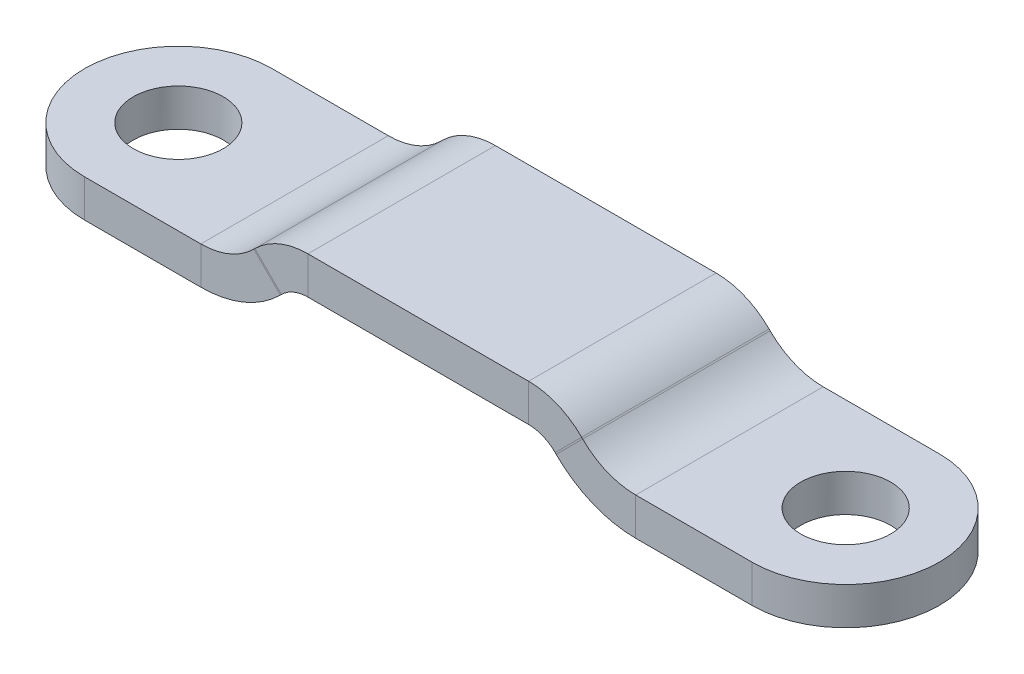
ISO-10303-21;
HEADER;
FILE_DESCRIPTION(('STEP AP214'),'2;1');
FILE_NAME('part.step','',(''),(''),'','','');
FILE_SCHEMA(('AUTOMOTIVE_DESIGN { 1 0 10303 214 1 1 1 1 }'));
ENDSEC;
DATA;
#1=APPLICATION_CONTEXT('core data for automotive mechanical design processes');
#2=APPLICATION_PROTOCOL_DEFINITION('international standard','automotive_design',2000,#1);
#3=PRODUCT_CONTEXT('',#1,'mechanical');
#4=PRODUCT('Part','Part','',(#3));
#5=PRODUCT_RELATED_PRODUCT_CATEGORY('part','',(#4));
#6=PRODUCT_DEFINITION_FORMATION('','',#4);
#7=PRODUCT_DEFINITION_CONTEXT('part definition',#1,'design');
#8=PRODUCT_DEFINITION('design','',#6,#7);
#9=PRODUCT_DEFINITION_SHAPE('','',#8);
#10=(LENGTH_UNIT() NAMED_UNIT(*) SI_UNIT(.MILLI.,.METRE.));
#11=(NAMED_UNIT(*) PLANE_ANGLE_UNIT() SI_UNIT($,.RADIAN.));
#12=(NAMED_UNIT(*) SI_UNIT($,.STERADIAN.) SOLID_ANGLE_UNIT());
#13=UNCERTAINTY_MEASURE_WITH_UNIT(LENGTH_MEASURE(1.E-05),#10,'distance_accuracy_value','');
#14=(GEOMETRIC_REPRESENTATION_CONTEXT(3) GLOBAL_UNCERTAINTY_ASSIGNED_CONTEXT((#13)) GLOBAL_UNIT_ASSIGNED_CONTEXT((#10,
#11,#12)) REPRESENTATION_CONTEXT('',''));
#15=CARTESIAN_POINT('',(0.,0.,0.));
#16=DIRECTION('',(0.,0.,1.));
#17=DIRECTION('',(1.,0.,0.));
#18=AXIS2_PLACEMENT_3D('',#15,#16,#17);
#19=CARTESIAN_POINT('',(-57.,0.,25.));
#20=DIRECTION('',(0.,-1.,0.));
#21=DIRECTION('',(0.,0.,-1.));
#22=AXIS2_PLACEMENT_3D('',#19,#20,#21);
#23=PLANE('',#22);
#24=CARTESIAN_POINT('',(-44.5,0.,12.5));
#25=DIRECTION('',(0.,1.,0.));
#26=DIRECTION('',(0.,0.,1.));
#27=AXIS2_PLACEMENT_3D('',#24,#25,#26);
#28=CIRCLE('',#27,6.);
#29=CARTESIAN_POINT('',(-44.5,0.,18.5));
#30=VERTEX_POINT('',#29);
#31=EDGE_CURVE('E954',#30,#30,#28,.T.);
#32=ORIENTED_EDGE('',*,*,#31,.F.);
#33=EDGE_LOOP('',(#32));
#34=FACE_BOUND('',#33,.T.);
#35=DIRECTION('',(-1.,0.,0.));
#36=VECTOR('',#35,1.);
#37=CARTESIAN_POINT('',(-57.,0.,0.));
#38=LINE('',#37,#36);
#39=CARTESIAN_POINT('',(-29.,0.,0.));
#40=VERTEX_POINT('',#39);
#41=CARTESIAN_POINT('',(-44.5,0.,0.));
#42=VERTEX_POINT('',#41);
#43=EDGE_CURVE('E271',#40,#42,#38,.T.);
#44=ORIENTED_EDGE('',*,*,#43,.T.);
#45=CARTESIAN_POINT('',(-44.5,0.,12.5));
#46=DIRECTION('',(0.,1.,0.));
#47=DIRECTION('',(0.,0.,1.));
#48=AXIS2_PLACEMENT_3D('',#45,#46,#47);
#49=CIRCLE('',#48,12.5);
#50=CARTESIAN_POINT('',(-44.5,0.,25.));
#51=VERTEX_POINT('',#50);
#52=EDGE_CURVE('E441',#42,#51,#49,.T.);
#53=ORIENTED_EDGE('',*,*,#52,.T.);
#54=DIRECTION('',(-1.,0.,0.));
#55=VECTOR('',#54,1.);
#56=CARTESIAN_POINT('',(-57.,0.,25.));
#57=LINE('',#56,#55);
#58=CARTESIAN_POINT('',(-29.,0.,25.));
#59=VERTEX_POINT('',#58);
#60=EDGE_CURVE('E319',#59,#51,#57,.T.);
#61=ORIENTED_EDGE('',*,*,#60,.F.);
#62=DIRECTION('',(0.,0.,-1.));
#63=VECTOR('',#62,1.);
#64=CARTESIAN_POINT('',(-29.,0.,25.));
#65=LINE('',#64,#63);
#66=EDGE_CURVE('E267',#59,#40,#65,.T.);
#67=ORIENTED_EDGE('',*,*,#66,.T.);
#68=EDGE_LOOP('',(#44,#53,#61,#67));
#69=FACE_BOUND('',#68,.T.);
#70=ADVANCED_FACE('F95',(#34,#69),#23,.F.);
#71=CARTESIAN_POINT('',(-57.,-5.,25.));
#72=DIRECTION('',(0.,-1.,0.));
#73=DIRECTION('',(0.,0.,-1.));
#74=AXIS2_PLACEMENT_3D('',#71,#72,#73);
#75=PLANE('',#74);
#76=CARTESIAN_POINT('',(-44.5,-5.,12.5));
#77=DIRECTION('',(0.,-1.,0.));
#78=DIRECTION('',(0.,0.,-1.));
#79=AXIS2_PLACEMENT_3D('',#76,#77,#78);
#80=CIRCLE('',#79,6.);
#81=CARTESIAN_POINT('',(-44.5,-5.,6.5));
#82=VERTEX_POINT('',#81);
#83=EDGE_CURVE('E99',#82,#82,#80,.T.);
#84=ORIENTED_EDGE('',*,*,#83,.F.);
#85=EDGE_LOOP('',(#84));
#86=FACE_BOUND('',#85,.T.);
#87=CARTESIAN_POINT('',(-44.5,-5.,12.5));
#88=DIRECTION('',(0.,-1.,0.));
#89=DIRECTION('',(0.,0.,-1.));
#90=AXIS2_PLACEMENT_3D('',#87,#88,#89);
#91=CIRCLE('',#90,12.5);
#92=CARTESIAN_POINT('',(-44.5,-5.,25.));
#93=VERTEX_POINT('',#92);
#94=CARTESIAN_POINT('',(-44.5,-5.,0.));
#95=VERTEX_POINT('',#94);
#96=EDGE_CURVE('E111',#93,#95,#91,.T.);
#97=ORIENTED_EDGE('',*,*,#96,.T.);
#98=DIRECTION('',(1.,0.,0.));
#99=VECTOR('',#98,1.);
#100=CARTESIAN_POINT('',(-57.,-5.,0.));
#101=LINE('',#100,#99);
#102=CARTESIAN_POINT('',(-29.,-5.,0.));
#103=VERTEX_POINT('',#102);
#104=EDGE_CURVE('E274',#103,#95,#101,.F.);
#105=ORIENTED_EDGE('',*,*,#104,.F.);
#106=DIRECTION('',(0.,0.,-1.));
#107=VECTOR('',#106,1.);
#108=CARTESIAN_POINT('',(-29.,-5.,25.));
#109=LINE('',#108,#107);
#110=CARTESIAN_POINT('',(-29.,-5.,25.));
#111=VERTEX_POINT('',#110);
#112=EDGE_CURVE('E357',#111,#103,#109,.T.);
#113=ORIENTED_EDGE('',*,*,#112,.F.);
#114=DIRECTION('',(1.,0.,0.));
#115=VECTOR('',#114,1.);
#116=CARTESIAN_POINT('',(-57.,-5.,25.));
#117=LINE('',#116,#115);
#118=EDGE_CURVE('E451',#111,#93,#117,.F.);
#119=ORIENTED_EDGE('',*,*,#118,.T.);
#120=EDGE_LOOP('',(#97,#105,#113,#119));
#121=FACE_BOUND('',#120,.T.);
#122=ADVANCED_FACE('F516',(#86,#121),#75,.T.);
#123=CARTESIAN_POINT('',(-18.3933982822018,-0.606601717798196,0.));
#124=DIRECTION('',(0.,0.,-1.));
#125=DIRECTION('',(-1.,0.,0.));
#126=AXIS2_PLACEMENT_3D('',#123,#124,#125);
#127=PLANE('',#126);
#128=ORIENTED_EDGE('',*,*,#104,.T.);
#129=DIRECTION('',(0.,1.,0.));
#130=VECTOR('',#129,1.);
#131=CARTESIAN_POINT('',(-44.5,-10.,0.));
#132=LINE('',#131,#130);
#133=EDGE_CURVE('E12',#95,#42,#132,.T.);
#134=ORIENTED_EDGE('',*,*,#133,.T.);
#135=ORIENTED_EDGE('',*,*,#43,.F.);
#136=DIRECTION('',(0.,-1.,0.));
#137=VECTOR('',#136,1.);
#138=CARTESIAN_POINT('',(-29.,0.,0.));
#139=LINE('',#138,#137);
#140=EDGE_CURVE('E178',#40,#103,#139,.T.);
#141=ORIENTED_EDGE('',*,*,#140,.T.);
#142=EDGE_LOOP('',(#128,#134,#135,#141));
#143=FACE_BOUND('',#142,.T.);
#144=ADVANCED_FACE('F523',(#143),#127,.T.);
#145=CARTESIAN_POINT('',(57.,-5.,25.));
#146=DIRECTION('',(0.,-1.,0.));
#147=DIRECTION('',(0.,0.,-1.));
#148=AXIS2_PLACEMENT_3D('',#145,#146,#147);
#149=PLANE('',#148);
#150=DIRECTION('',(1.,0.,0.));
#151=VECTOR('',#150,1.);
#152=CARTESIAN_POINT('',(57.,-5.,0.));
#153=LINE('',#152,#151);
#154=CARTESIAN_POINT('',(44.5,-5.,0.));
#155=VERTEX_POINT('',#154);
#156=CARTESIAN_POINT('',(29.,-5.,0.));
#157=VERTEX_POINT('',#156);
#158=EDGE_CURVE('E298',#155,#157,#153,.F.);
#159=ORIENTED_EDGE('',*,*,#158,.F.);
#160=CARTESIAN_POINT('',(44.5,-5.,12.5));
#161=DIRECTION('',(0.,-1.,0.));
#162=DIRECTION('',(0.,0.,-1.));
#163=AXIS2_PLACEMENT_3D('',#160,#161,#162);
#164=CIRCLE('',#163,12.5);
#165=CARTESIAN_POINT('',(44.5,-5.,25.));
#166=VERTEX_POINT('',#165);
#167=EDGE_CURVE('E275',#166,#155,#164,.F.);
#168=ORIENTED_EDGE('',*,*,#167,.F.);
#169=DIRECTION('',(1.,0.,0.));
#170=VECTOR('',#169,1.);
#171=CARTESIAN_POINT('',(57.,-5.,25.));
#172=LINE('',#171,#170);
#173=CARTESIAN_POINT('',(29.,-5.,25.));
#174=VERTEX_POINT('',#173);
#175=EDGE_CURVE('E412',#166,#174,#172,.F.);
#176=ORIENTED_EDGE('',*,*,#175,.T.);
#177=DIRECTION('',(0.,0.,-1.));
#178=VECTOR('',#177,1.);
#179=CARTESIAN_POINT('',(29.,-5.,25.));
#180=LINE('',#179,#178);
#181=EDGE_CURVE('E336',#174,#157,#180,.T.);
#182=ORIENTED_EDGE('',*,*,#181,.T.);
#183=EDGE_LOOP('',(#159,#168,#176,#182));
#184=FACE_BOUND('',#183,.T.);
#185=CARTESIAN_POINT('',(44.5,-5.,12.5));
#186=DIRECTION('',(0.,-1.,0.));
#187=DIRECTION('',(0.,0.,-1.));
#188=AXIS2_PLACEMENT_3D('',#185,#186,#187);
#189=CIRCLE('',#188,6.);
#190=CARTESIAN_POINT('',(44.5,-5.,6.5));
#191=VERTEX_POINT('',#190);
#192=EDGE_CURVE('E444',#191,#191,#189,.T.);
#193=ORIENTED_EDGE('',*,*,#192,.F.);
#194=EDGE_LOOP('',(#193));
#195=FACE_BOUND('',#194,.T.);
#196=ADVANCED_FACE('F407',(#184,#195),#149,.T.);
#197=CARTESIAN_POINT('',(57.,0.,25.));
#198=DIRECTION('',(0.,-1.,0.));
#199=DIRECTION('',(0.,0.,-1.));
#200=AXIS2_PLACEMENT_3D('',#197,#198,#199);
#201=PLANE('',#200);
#202=CARTESIAN_POINT('',(44.5,0.,12.5));
#203=DIRECTION('',(0.,1.,0.));
#204=DIRECTION('',(0.,0.,1.));
#205=AXIS2_PLACEMENT_3D('',#202,#203,#204);
#206=CIRCLE('',#205,6.);
#207=CARTESIAN_POINT('',(44.5,0.,18.5));
#208=VERTEX_POINT('',#207);
#209=EDGE_CURVE('E955',#208,#208,#206,.T.);
#210=ORIENTED_EDGE('',*,*,#209,.F.);
#211=EDGE_LOOP('',(#210));
#212=FACE_BOUND('',#211,.T.);
#213=CARTESIAN_POINT('',(44.5,0.,12.5));
#214=DIRECTION('',(0.,1.,0.));
#215=DIRECTION('',(0.,0.,1.));
#216=AXIS2_PLACEMENT_3D('',#213,#214,#215);
#217=CIRCLE('',#216,12.5);
#218=CARTESIAN_POINT('',(44.5,0.,0.));
#219=VERTEX_POINT('',#218);
#220=CARTESIAN_POINT('',(44.5,0.,25.));
#221=VERTEX_POINT('',#220);
#222=EDGE_CURVE('E435',#219,#221,#217,.F.);
#223=ORIENTED_EDGE('',*,*,#222,.F.);
#224=DIRECTION('',(-1.,0.,0.));
#225=VECTOR('',#224,1.);
#226=CARTESIAN_POINT('',(57.,0.,0.));
#227=LINE('',#226,#225);
#228=CARTESIAN_POINT('',(29.,0.,0.));
#229=VERTEX_POINT('',#228);
#230=EDGE_CURVE('E300',#219,#229,#227,.T.);
#231=ORIENTED_EDGE('',*,*,#230,.T.);
#232=DIRECTION('',(0.,0.,-1.));
#233=VECTOR('',#232,1.);
#234=CARTESIAN_POINT('',(29.,0.,25.));
#235=LINE('',#234,#233);
#236=CARTESIAN_POINT('',(29.,0.,25.));
#237=VERTEX_POINT('',#236);
#238=EDGE_CURVE('E333',#237,#229,#235,.T.);
#239=ORIENTED_EDGE('',*,*,#238,.F.);
#240=DIRECTION('',(-1.,0.,0.));
#241=VECTOR('',#240,1.);
#242=CARTESIAN_POINT('',(57.,0.,25.));
#243=LINE('',#242,#241);
#244=EDGE_CURVE('E434',#221,#237,#243,.T.);
#245=ORIENTED_EDGE('',*,*,#244,.F.);
#246=EDGE_LOOP('',(#223,#231,#239,#245));
#247=FACE_BOUND('',#246,.T.);
#248=ADVANCED_FACE('F432',(#212,#247),#201,.F.);
#249=CARTESIAN_POINT('',(-21.9289321881345,2.92893218813454,25.));
#250=DIRECTION('',(0.,0.,1.));
#251=DIRECTION('',(1.,0.,0.));
#252=AXIS2_PLACEMENT_3D('',#249,#250,#251);
#253=PLANE('',#252);
#254=DIRECTION('',(0.707106781186548,-0.707106781186547,0.));
#255=VECTOR('',#254,1.);
#256=CARTESIAN_POINT('',(-21.9289321881345,2.92893218813454,25.));
#257=LINE('',#256,#255);
#258=CARTESIAN_POINT('',(-21.9289321881345,2.92893218813454,25.));
#259=VERTEX_POINT('',#258);
#260=CARTESIAN_POINT('',(-18.3933982822018,-0.606601717798196,25.));
#261=VERTEX_POINT('',#260);
#262=EDGE_CURVE('E386',#259,#261,#257,.T.);
#263=ORIENTED_EDGE('',*,*,#262,.F.);
#264=CARTESIAN_POINT('',(-29.,10.,25.));
#265=DIRECTION('',(0.,0.,-1.));
#266=DIRECTION('',(1.,0.,0.));
#267=AXIS2_PLACEMENT_3D('',#264,#265,#266);
#268=CIRCLE('',#267,10.);
#269=EDGE_CURVE('E265',#259,#59,#268,.T.);
#270=ORIENTED_EDGE('',*,*,#269,.T.);
#271=DIRECTION('',(0.,1.,0.));
#272=VECTOR('',#271,1.);
#273=CARTESIAN_POINT('',(-29.,-5.,25.));
#274=LINE('',#273,#272);
#275=EDGE_CURVE('E120',#111,#59,#274,.T.);
#276=ORIENTED_EDGE('',*,*,#275,.F.);
#277=CARTESIAN_POINT('',(-29.,10.,25.));
#278=DIRECTION('',(0.,0.,1.));
#279=DIRECTION('',(1.,0.,0.));
#280=AXIS2_PLACEMENT_3D('',#277,#278,#279);
#281=CIRCLE('',#280,15.);
#282=EDGE_CURVE('E454',#261,#111,#281,.F.);
#283=ORIENTED_EDGE('',*,*,#282,.F.);
#284=EDGE_LOOP('',(#263,#270,#276,#283));
#285=FACE_BOUND('',#284,.T.);
#286=ADVANCED_FACE('F97',(#285),#253,.T.);
#287=CARTESIAN_POINT('',(-29.,-5.,25.));
#288=DIRECTION('',(0.,0.,1.));
#289=DIRECTION('',(1.,0.,0.));
#290=AXIS2_PLACEMENT_3D('',#287,#288,#289);
#291=PLANE('',#290);
#292=DIRECTION('',(-0.707106781186572,-0.707106781186523,0.));
#293=VECTOR('',#292,1.);
#294=CARTESIAN_POINT('',(-21.9289321881345,2.92893218813454,25.));
#295=LINE('',#294,#293);
#296=CARTESIAN_POINT('',(-21.7867965644036,3.07106781186545,25.));
#297=VERTEX_POINT('',#296);
#298=EDGE_CURVE('E230',#297,#259,#295,.T.);
#299=ORIENTED_EDGE('',*,*,#298,.T.);
#300=ORIENTED_EDGE('',*,*,#262,.T.);
#301=DIRECTION('',(-0.707106781186572,-0.707106781186523,0.));
#302=VECTOR('',#301,1.);
#303=CARTESIAN_POINT('',(-18.3933982822019,-0.60660171779832,25.));
#304=LINE('',#303,#302);
#305=CARTESIAN_POINT('',(-18.251262658471,-0.46446609406741,25.));
#306=VERTEX_POINT('',#305);
#307=EDGE_CURVE('E233',#306,#261,#304,.T.);
#308=ORIENTED_EDGE('',*,*,#307,.F.);
#309=DIRECTION('',(-0.707106781186523,0.707106781186572,0.));
#310=VECTOR('',#309,1.);
#311=CARTESIAN_POINT('',(-18.251262658471,-0.46446609406741,25.));
#312=LINE('',#311,#310);
#313=EDGE_CURVE('E226',#306,#297,#312,.T.);
#314=ORIENTED_EDGE('',*,*,#313,.T.);
#315=EDGE_LOOP('',(#299,#300,#308,#314));
#316=FACE_BOUND('',#315,.T.);
#317=ADVANCED_FACE('F228',(#316),#291,.T.);
#318=CARTESIAN_POINT('',(-29.,0.,0.));
#319=DIRECTION('',(0.,0.,-1.));
#320=DIRECTION('',(-1.,0.,0.));
#321=AXIS2_PLACEMENT_3D('',#318,#319,#320);
#322=PLANE('',#321);
#323=ORIENTED_EDGE('',*,*,#140,.F.);
#324=CARTESIAN_POINT('',(-29.,10.,0.));
#325=DIRECTION('',(0.,0.,-1.));
#326=DIRECTION('',(1.,0.,0.));
#327=AXIS2_PLACEMENT_3D('',#324,#325,#326);
#328=CIRCLE('',#327,10.);
#329=CARTESIAN_POINT('',(-21.9289321881345,2.92893218813454,0.));
#330=VERTEX_POINT('',#329);
#331=EDGE_CURVE('E317',#330,#40,#328,.T.);
#332=ORIENTED_EDGE('',*,*,#331,.F.);
#333=DIRECTION('',(-0.707106781186548,0.707106781186547,0.));
#334=VECTOR('',#333,1.);
#335=CARTESIAN_POINT('',(-18.3933982822018,-0.606601717798196,0.));
#336=LINE('',#335,#334);
#337=CARTESIAN_POINT('',(-18.3933982822018,-0.606601717798196,0.));
#338=VERTEX_POINT('',#337);
#339=EDGE_CURVE('E382',#338,#330,#336,.T.);
#340=ORIENTED_EDGE('',*,*,#339,.F.);
#341=CARTESIAN_POINT('',(-29.,10.,0.));
#342=DIRECTION('',(0.,0.,1.));
#343=DIRECTION('',(1.,0.,0.));
#344=AXIS2_PLACEMENT_3D('',#341,#342,#343);
#345=CIRCLE('',#344,15.);
#346=EDGE_CURVE('E278',#338,#103,#345,.F.);
#347=ORIENTED_EDGE('',*,*,#346,.T.);
#348=EDGE_LOOP('',(#323,#332,#340,#347));
#349=FACE_BOUND('',#348,.T.);
#350=ADVANCED_FACE('F503',(#349),#322,.T.);
#351=CARTESIAN_POINT('',(-14.7157287525381,5.99999999999999,25.));
#352=DIRECTION('',(0.,0.,1.));
#353=DIRECTION('',(1.,0.,0.));
#354=AXIS2_PLACEMENT_3D('',#351,#352,#353);
#355=PLANE('',#354);
#356=DIRECTION('',(0.,-1.,0.));
#357=VECTOR('',#356,1.);
#358=CARTESIAN_POINT('',(-14.7157287525381,5.99999999999999,25.));
#359=LINE('',#358,#357);
#360=CARTESIAN_POINT('',(-14.7157287525381,5.99999999999999,25.));
#361=VERTEX_POINT('',#360);
#362=CARTESIAN_POINT('',(-14.7157287525381,0.99999999999999,25.));
#363=VERTEX_POINT('',#362);
#364=EDGE_CURVE('E238',#361,#363,#359,.T.);
#365=ORIENTED_EDGE('',*,*,#364,.F.);
#366=CARTESIAN_POINT('',(-14.7157287525381,-4.00000000000001,25.));
#367=DIRECTION('',(0.,0.,1.));
#368=DIRECTION('',(-1.,0.,0.));
#369=AXIS2_PLACEMENT_3D('',#366,#367,#368);
#370=CIRCLE('',#369,10.);
#371=EDGE_CURVE('E242',#361,#297,#370,.T.);
#372=ORIENTED_EDGE('',*,*,#371,.T.);
#373=ORIENTED_EDGE('',*,*,#313,.F.);
#374=CARTESIAN_POINT('',(-14.7157287525381,-4.00000000000001,25.));
#375=DIRECTION('',(0.,0.,1.));
#376=DIRECTION('',(1.,0.,0.));
#377=AXIS2_PLACEMENT_3D('',#374,#375,#376);
#378=CIRCLE('',#377,5.);
#379=EDGE_CURVE('E458',#363,#306,#378,.T.);
#380=ORIENTED_EDGE('',*,*,#379,.F.);
#381=EDGE_LOOP('',(#365,#372,#373,#380));
#382=FACE_BOUND('',#381,.T.);
#383=ADVANCED_FACE('F244',(#382),#355,.T.);
#384=CARTESIAN_POINT('',(-18.251262658471,-0.46446609406741,25.));
#385=DIRECTION('',(0.,0.,1.));
#386=DIRECTION('',(1.,0.,0.));
#387=AXIS2_PLACEMENT_3D('',#384,#385,#386);
#388=PLANE('',#387);
#389=DIRECTION('',(-1.,0.,0.));
#390=VECTOR('',#389,1.);
#391=CARTESIAN_POINT('',(-14.7157287525381,5.99999999999999,25.));
#392=LINE('',#391,#390);
#393=CARTESIAN_POINT('',(14.7157287525381,5.99999999999999,25.));
#394=VERTEX_POINT('',#393);
#395=EDGE_CURVE('E248',#394,#361,#392,.T.);
#396=ORIENTED_EDGE('',*,*,#395,.T.);
#397=ORIENTED_EDGE('',*,*,#364,.T.);
#398=DIRECTION('',(1.,0.,0.));
#399=VECTOR('',#398,1.);
#400=CARTESIAN_POINT('',(-14.7157287525381,0.999999999999991,25.));
#401=LINE('',#400,#399);
#402=CARTESIAN_POINT('',(14.7157287525381,0.999999999999991,25.));
#403=VERTEX_POINT('',#402);
#404=EDGE_CURVE('E460',#403,#363,#401,.F.);
#405=ORIENTED_EDGE('',*,*,#404,.F.);
#406=DIRECTION('',(0.,1.,0.));
#407=VECTOR('',#406,1.);
#408=CARTESIAN_POINT('',(14.7157287525381,0.999999999999991,25.));
#409=LINE('',#408,#407);
#410=EDGE_CURVE('E374',#403,#394,#409,.T.);
#411=ORIENTED_EDGE('',*,*,#410,.T.);
#412=EDGE_LOOP('',(#396,#397,#405,#411));
#413=FACE_BOUND('',#412,.T.);
#414=ADVANCED_FACE('F482',(#413),#388,.T.);
#415=CARTESIAN_POINT('',(-21.7867965644036,3.07106781186545,0.));
#416=DIRECTION('',(0.,0.,-1.));
#417=DIRECTION('',(-1.,0.,0.));
#418=AXIS2_PLACEMENT_3D('',#415,#416,#417);
#419=PLANE('',#418);
#420=DIRECTION('',(0.707106781186523,-0.707106781186572,0.));
#421=VECTOR('',#420,1.);
#422=CARTESIAN_POINT('',(-21.7867965644036,3.07106781186545,0.));
#423=LINE('',#422,#421);
#424=CARTESIAN_POINT('',(-21.7867965644036,3.07106781186545,0.));
#425=VERTEX_POINT('',#424);
#426=CARTESIAN_POINT('',(-18.251262658471,-0.46446609406741,0.));
#427=VERTEX_POINT('',#426);
#428=EDGE_CURVE('E239',#425,#427,#423,.T.);
#429=ORIENTED_EDGE('',*,*,#428,.F.);
#430=CARTESIAN_POINT('',(-14.7157287525381,-4.00000000000001,0.));
#431=DIRECTION('',(0.,0.,1.));
#432=DIRECTION('',(-1.,0.,0.));
#433=AXIS2_PLACEMENT_3D('',#430,#431,#432);
#434=CIRCLE('',#433,10.);
#435=CARTESIAN_POINT('',(-14.7157287525381,5.99999999999999,0.));
#436=VERTEX_POINT('',#435);
#437=EDGE_CURVE('E255',#436,#425,#434,.T.);
#438=ORIENTED_EDGE('',*,*,#437,.F.);
#439=DIRECTION('',(0.,1.,0.));
#440=VECTOR('',#439,1.);
#441=CARTESIAN_POINT('',(-14.7157287525381,0.99999999999999,0.));
#442=LINE('',#441,#440);
#443=CARTESIAN_POINT('',(-14.7157287525381,0.99999999999999,0.));
#444=VERTEX_POINT('',#443);
#445=EDGE_CURVE('E378',#444,#436,#442,.T.);
#446=ORIENTED_EDGE('',*,*,#445,.F.);
#447=CARTESIAN_POINT('',(-14.7157287525381,-4.00000000000001,0.));
#448=DIRECTION('',(0.,0.,1.));
#449=DIRECTION('',(1.,0.,0.));
#450=AXIS2_PLACEMENT_3D('',#447,#448,#449);
#451=CIRCLE('',#450,5.);
#452=EDGE_CURVE('E283',#444,#427,#451,.T.);
#453=ORIENTED_EDGE('',*,*,#452,.T.);
#454=EDGE_LOOP('',(#429,#438,#446,#453));
#455=FACE_BOUND('',#454,.T.);
#456=ADVANCED_FACE('F489',(#455),#419,.T.);
#457=CARTESIAN_POINT('',(-14.7157287525381,0.99999999999999,0.));
#458=DIRECTION('',(0.,0.,-1.));
#459=DIRECTION('',(-1.,0.,0.));
#460=AXIS2_PLACEMENT_3D('',#457,#458,#459);
#461=PLANE('',#460);
#462=DIRECTION('',(-0.707106781186572,-0.707106781186523,0.));
#463=VECTOR('',#462,1.);
#464=CARTESIAN_POINT('',(-21.9289321881345,2.92893218813454,0.));
#465=LINE('',#464,#463);
#466=EDGE_CURVE('E315',#425,#330,#465,.T.);
#467=ORIENTED_EDGE('',*,*,#466,.F.);
#468=ORIENTED_EDGE('',*,*,#428,.T.);
#469=DIRECTION('',(-0.707106781186572,-0.707106781186523,0.));
#470=VECTOR('',#469,1.);
#471=CARTESIAN_POINT('',(-18.3933982822019,-0.60660171779832,0.));
#472=LINE('',#471,#470);
#473=EDGE_CURVE('E280',#427,#338,#472,.T.);
#474=ORIENTED_EDGE('',*,*,#473,.T.);
#475=ORIENTED_EDGE('',*,*,#339,.T.);
#476=EDGE_LOOP('',(#467,#468,#474,#475));
#477=FACE_BOUND('',#476,.T.);
#478=ADVANCED_FACE('F492',(#477),#461,.T.);
#479=CARTESIAN_POINT('',(21.7867965644036,3.07106781186545,25.));
#480=DIRECTION('',(0.,0.,1.));
#481=DIRECTION('',(1.,0.,0.));
#482=AXIS2_PLACEMENT_3D('',#479,#480,#481);
#483=PLANE('',#482);
#484=DIRECTION('',(-0.707106781186549,-0.707106781186546,0.));
#485=VECTOR('',#484,1.);
#486=CARTESIAN_POINT('',(21.7867965644036,3.07106781186545,25.));
#487=LINE('',#486,#485);
#488=CARTESIAN_POINT('',(21.7867965644036,3.07106781186545,25.));
#489=VERTEX_POINT('',#488);
#490=CARTESIAN_POINT('',(18.2512626584709,-0.464466094067278,25.));
#491=VERTEX_POINT('',#490);
#492=EDGE_CURVE('E376',#489,#491,#487,.T.);
#493=ORIENTED_EDGE('',*,*,#492,.F.);
#494=CARTESIAN_POINT('',(14.7157287525381,-4.00000000000001,25.));
#495=DIRECTION('',(0.,0.,1.));
#496=DIRECTION('',(1.,0.,0.));
#497=AXIS2_PLACEMENT_3D('',#494,#495,#496);
#498=CIRCLE('',#497,10.);
#499=EDGE_CURVE('E477',#489,#394,#498,.T.);
#500=ORIENTED_EDGE('',*,*,#499,.T.);
#501=ORIENTED_EDGE('',*,*,#410,.F.);
#502=CARTESIAN_POINT('',(14.7157287525381,-4.00000000000001,25.));
#503=DIRECTION('',(0.,0.,1.));
#504=DIRECTION('',(1.,0.,0.));
#505=AXIS2_PLACEMENT_3D('',#502,#503,#504);
#506=CIRCLE('',#505,5.);
#507=EDGE_CURVE('E463',#491,#403,#506,.T.);
#508=ORIENTED_EDGE('',*,*,#507,.F.);
#509=EDGE_LOOP('',(#493,#500,#501,#508));
#510=FACE_BOUND('',#509,.T.);
#511=ADVANCED_FACE('F555',(#510),#483,.T.);
#512=CARTESIAN_POINT('',(14.7157287525381,0.999999999999991,25.));
#513=DIRECTION('',(0.,0.,1.));
#514=DIRECTION('',(1.,0.,0.));
#515=AXIS2_PLACEMENT_3D('',#512,#513,#514);
#516=PLANE('',#515);
#517=DIRECTION('',(-0.707106781186555,0.70710678118654,0.));
#518=VECTOR('',#517,1.);
#519=CARTESIAN_POINT('',(21.9289321881345,2.92893218813454,25.));
#520=LINE('',#519,#518);
#521=CARTESIAN_POINT('',(21.9289321881345,2.92893218813454,25.));
#522=VERTEX_POINT('',#521);
#523=EDGE_CURVE('E474',#522,#489,#520,.T.);
#524=ORIENTED_EDGE('',*,*,#523,.T.);
#525=ORIENTED_EDGE('',*,*,#492,.T.);
#526=DIRECTION('',(-0.707106781186555,0.70710678118654,0.));
#527=VECTOR('',#526,1.);
#528=CARTESIAN_POINT('',(18.3933982822018,-0.606601717798236,25.));
#529=LINE('',#528,#527);
#530=CARTESIAN_POINT('',(18.3933982822018,-0.606601717798236,25.));
#531=VERTEX_POINT('',#530);
#532=EDGE_CURVE('E466',#531,#491,#529,.T.);
#533=ORIENTED_EDGE('',*,*,#532,.F.);
#534=DIRECTION('',(0.70710678118654,0.707106781186555,0.));
#535=VECTOR('',#534,1.);
#536=CARTESIAN_POINT('',(18.3933982822018,-0.606601717798236,25.));
#537=LINE('',#536,#535);
#538=EDGE_CURVE('E365',#531,#522,#537,.T.);
#539=ORIENTED_EDGE('',*,*,#538,.T.);
#540=EDGE_LOOP('',(#524,#525,#533,#539));
#541=FACE_BOUND('',#540,.T.);
#542=ADVANCED_FACE('F551',(#541),#516,.T.);
#543=CARTESIAN_POINT('',(14.7157287525381,5.99999999999999,0.));
#544=DIRECTION('',(0.,0.,-1.));
#545=DIRECTION('',(-1.,0.,0.));
#546=AXIS2_PLACEMENT_3D('',#543,#544,#545);
#547=PLANE('',#546);
#548=DIRECTION('',(0.,-1.,0.));
#549=VECTOR('',#548,1.);
#550=CARTESIAN_POINT('',(14.7157287525381,5.99999999999999,0.));
#551=LINE('',#550,#549);
#552=CARTESIAN_POINT('',(14.7157287525381,5.99999999999999,0.));
#553=VERTEX_POINT('',#552);
#554=CARTESIAN_POINT('',(14.7157287525381,0.999999999999991,0.));
#555=VERTEX_POINT('',#554);
#556=EDGE_CURVE('E372',#553,#555,#551,.T.);
#557=ORIENTED_EDGE('',*,*,#556,.F.);
#558=CARTESIAN_POINT('',(14.7157287525381,-4.00000000000001,0.));
#559=DIRECTION('',(0.,0.,1.));
#560=DIRECTION('',(1.,0.,0.));
#561=AXIS2_PLACEMENT_3D('',#558,#559,#560);
#562=CIRCLE('',#561,10.);
#563=CARTESIAN_POINT('',(21.7867965644036,3.07106781186545,0.));
#564=VERTEX_POINT('',#563);
#565=EDGE_CURVE('E308',#564,#553,#562,.T.);
#566=ORIENTED_EDGE('',*,*,#565,.F.);
#567=DIRECTION('',(0.707106781186549,0.707106781186546,0.));
#568=VECTOR('',#567,1.);
#569=CARTESIAN_POINT('',(18.2512626584709,-0.464466094067278,0.));
#570=LINE('',#569,#568);
#571=CARTESIAN_POINT('',(18.2512626584709,-0.464466094067278,0.));
#572=VERTEX_POINT('',#571);
#573=EDGE_CURVE('E370',#572,#564,#570,.T.);
#574=ORIENTED_EDGE('',*,*,#573,.F.);
#575=CARTESIAN_POINT('',(14.7157287525381,-4.00000000000001,0.));
#576=DIRECTION('',(0.,0.,1.));
#577=DIRECTION('',(1.,0.,0.));
#578=AXIS2_PLACEMENT_3D('',#575,#576,#577);
#579=CIRCLE('',#578,5.);
#580=EDGE_CURVE('E289',#572,#555,#579,.T.);
#581=ORIENTED_EDGE('',*,*,#580,.T.);
#582=EDGE_LOOP('',(#557,#566,#574,#581));
#583=FACE_BOUND('',#582,.T.);
#584=ADVANCED_FACE('F547',(#583),#547,.T.);
#585=CARTESIAN_POINT('',(18.2512626584709,-0.464466094067278,0.));
#586=DIRECTION('',(0.,0.,-1.));
#587=DIRECTION('',(-1.,0.,0.));
#588=AXIS2_PLACEMENT_3D('',#585,#586,#587);
#589=PLANE('',#588);
#590=DIRECTION('',(-1.,0.,0.));
#591=VECTOR('',#590,1.);
#592=CARTESIAN_POINT('',(-14.7157287525381,5.99999999999999,0.));
#593=LINE('',#592,#591);
#594=EDGE_CURVE('E311',#553,#436,#593,.T.);
#595=ORIENTED_EDGE('',*,*,#594,.F.);
#596=ORIENTED_EDGE('',*,*,#556,.T.);
#597=DIRECTION('',(1.,0.,0.));
#598=VECTOR('',#597,1.);
#599=CARTESIAN_POINT('',(-14.7157287525381,0.999999999999991,0.));
#600=LINE('',#599,#598);
#601=EDGE_CURVE('E286',#555,#444,#600,.F.);
#602=ORIENTED_EDGE('',*,*,#601,.T.);
#603=ORIENTED_EDGE('',*,*,#445,.T.);
#604=EDGE_LOOP('',(#595,#596,#602,#603));
#605=FACE_BOUND('',#604,.T.);
#606=ADVANCED_FACE('F543',(#605),#589,.T.);
#607=CARTESIAN_POINT('',(29.,0.,25.));
#608=DIRECTION('',(0.,0.,1.));
#609=DIRECTION('',(1.,0.,0.));
#610=AXIS2_PLACEMENT_3D('',#607,#608,#609);
#611=PLANE('',#610);
#612=DIRECTION('',(0.,-1.,0.));
#613=VECTOR('',#612,1.);
#614=CARTESIAN_POINT('',(29.,0.,25.));
#615=LINE('',#614,#613);
#616=EDGE_CURVE('E367',#237,#174,#615,.T.);
#617=ORIENTED_EDGE('',*,*,#616,.F.);
#618=CARTESIAN_POINT('',(29.,10.,25.));
#619=DIRECTION('',(0.,0.,-1.));
#620=DIRECTION('',(-1.,0.,0.));
#621=AXIS2_PLACEMENT_3D('',#618,#619,#620);
#622=CIRCLE('',#621,10.);
#623=EDGE_CURVE('E428',#237,#522,#622,.T.);
#624=ORIENTED_EDGE('',*,*,#623,.T.);
#625=ORIENTED_EDGE('',*,*,#538,.F.);
#626=CARTESIAN_POINT('',(29.,10.,25.));
#627=DIRECTION('',(0.,0.,1.));
#628=DIRECTION('',(1.,0.,0.));
#629=AXIS2_PLACEMENT_3D('',#626,#627,#628);
#630=CIRCLE('',#629,15.);
#631=EDGE_CURVE('E469',#174,#531,#630,.F.);
#632=ORIENTED_EDGE('',*,*,#631,.F.);
#633=EDGE_LOOP('',(#617,#624,#625,#632));
#634=FACE_BOUND('',#633,.T.);
#635=ADVANCED_FACE('F539',(#634),#611,.T.);
#636=CARTESIAN_POINT('',(18.3933982822018,-0.606601717798236,25.));
#637=DIRECTION('',(0.,0.,1.));
#638=DIRECTION('',(1.,0.,0.));
#639=AXIS2_PLACEMENT_3D('',#636,#637,#638);
#640=PLANE('',#639);
#641=DIRECTION('',(0.,1.,0.));
#642=VECTOR('',#641,1.);
#643=CARTESIAN_POINT('',(44.5,-10.,25.));
#644=LINE('',#643,#642);
#645=EDGE_CURVE('E439',#166,#221,#644,.T.);
#646=ORIENTED_EDGE('',*,*,#645,.T.);
#647=ORIENTED_EDGE('',*,*,#244,.T.);
#648=ORIENTED_EDGE('',*,*,#616,.T.);
#649=ORIENTED_EDGE('',*,*,#175,.F.);
#650=EDGE_LOOP('',(#646,#647,#648,#649));
#651=FACE_BOUND('',#650,.T.);
#652=ADVANCED_FACE('F536',(#651),#640,.T.);
#653=CARTESIAN_POINT('',(21.9289321881345,2.92893218813454,0.));
#654=DIRECTION('',(0.,0.,-1.));
#655=DIRECTION('',(-1.,0.,0.));
#656=AXIS2_PLACEMENT_3D('',#653,#654,#655);
#657=PLANE('',#656);
#658=DIRECTION('',(-0.70710678118654,-0.707106781186555,0.));
#659=VECTOR('',#658,1.);
#660=CARTESIAN_POINT('',(21.9289321881345,2.92893218813454,0.));
#661=LINE('',#660,#659);
#662=CARTESIAN_POINT('',(21.9289321881345,2.92893218813454,0.));
#663=VERTEX_POINT('',#662);
#664=CARTESIAN_POINT('',(18.3933982822018,-0.606601717798236,0.));
#665=VERTEX_POINT('',#664);
#666=EDGE_CURVE('E363',#663,#665,#661,.T.);
#667=ORIENTED_EDGE('',*,*,#666,.F.);
#668=CARTESIAN_POINT('',(29.,10.,0.));
#669=DIRECTION('',(0.,0.,-1.));
#670=DIRECTION('',(-1.,0.,0.));
#671=AXIS2_PLACEMENT_3D('',#668,#669,#670);
#672=CIRCLE('',#671,10.);
#673=EDGE_CURVE('E302',#229,#663,#672,.T.);
#674=ORIENTED_EDGE('',*,*,#673,.F.);
#675=DIRECTION('',(0.,1.,0.));
#676=VECTOR('',#675,1.);
#677=CARTESIAN_POINT('',(29.,-5.,0.));
#678=LINE('',#677,#676);
#679=EDGE_CURVE('E360',#157,#229,#678,.T.);
#680=ORIENTED_EDGE('',*,*,#679,.F.);
#681=CARTESIAN_POINT('',(29.,10.,0.));
#682=DIRECTION('',(0.,0.,1.));
#683=DIRECTION('',(1.,0.,0.));
#684=AXIS2_PLACEMENT_3D('',#681,#682,#683);
#685=CIRCLE('',#684,15.);
#686=EDGE_CURVE('E295',#157,#665,#685,.F.);
#687=ORIENTED_EDGE('',*,*,#686,.T.);
#688=EDGE_LOOP('',(#667,#674,#680,#687));
#689=FACE_BOUND('',#688,.T.);
#690=ADVANCED_FACE('F420',(#689),#657,.T.);
#691=CARTESIAN_POINT('',(29.,-5.,0.));
#692=DIRECTION('',(0.,0.,-1.));
#693=DIRECTION('',(-1.,0.,0.));
#694=AXIS2_PLACEMENT_3D('',#691,#692,#693);
#695=PLANE('',#694);
#696=DIRECTION('',(-0.707106781186555,0.70710678118654,0.));
#697=VECTOR('',#696,1.);
#698=CARTESIAN_POINT('',(21.9289321881345,2.92893218813454,0.));
#699=LINE('',#698,#697);
#700=EDGE_CURVE('E305',#663,#564,#699,.T.);
#701=ORIENTED_EDGE('',*,*,#700,.F.);
#702=ORIENTED_EDGE('',*,*,#666,.T.);
#703=DIRECTION('',(-0.707106781186555,0.70710678118654,0.));
#704=VECTOR('',#703,1.);
#705=CARTESIAN_POINT('',(18.3933982822018,-0.606601717798236,0.));
#706=LINE('',#705,#704);
#707=EDGE_CURVE('E292',#665,#572,#706,.T.);
#708=ORIENTED_EDGE('',*,*,#707,.T.);
#709=ORIENTED_EDGE('',*,*,#573,.T.);
#710=EDGE_LOOP('',(#701,#702,#708,#709));
#711=FACE_BOUND('',#710,.T.);
#712=ADVANCED_FACE('F530',(#711),#695,.T.);
#713=CARTESIAN_POINT('',(-29.,10.,25.));
#714=DIRECTION('',(0.,0.,-1.));
#715=DIRECTION('',(-1.,0.,0.));
#716=AXIS2_PLACEMENT_3D('',#713,#714,#715);
#717=CYLINDRICAL_SURFACE('',#716,15.);
#718=ORIENTED_EDGE('',*,*,#346,.F.);
#719=DIRECTION('',(0.,0.,-1.));
#720=VECTOR('',#719,1.);
#721=CARTESIAN_POINT('',(-18.3933982822018,-0.606601717798196,25.));
#722=LINE('',#721,#720);
#723=EDGE_CURVE('E354',#261,#338,#722,.T.);
#724=ORIENTED_EDGE('',*,*,#723,.F.);
#725=ORIENTED_EDGE('',*,*,#282,.T.);
#726=ORIENTED_EDGE('',*,*,#112,.T.);
#727=EDGE_LOOP('',(#718,#724,#725,#726));
#728=FACE_BOUND('',#727,.T.);
#729=ADVANCED_FACE('F501',(#728),#717,.T.);
#730=CARTESIAN_POINT('',(-18.3933982822019,-0.60660171779832,25.));
#731=DIRECTION('',(0.707106781186523,-0.707106781186572,0.));
#732=DIRECTION('',(0.707106781186572,0.707106781186523,0.));
#733=AXIS2_PLACEMENT_3D('',#730,#731,#732);
#734=PLANE('',#733);
#735=ORIENTED_EDGE('',*,*,#473,.F.);
#736=DIRECTION('',(0.,0.,-1.));
#737=VECTOR('',#736,1.);
#738=CARTESIAN_POINT('',(-18.251262658471,-0.46446609406741,25.));
#739=LINE('',#738,#737);
#740=EDGE_CURVE('E351',#306,#427,#739,.T.);
#741=ORIENTED_EDGE('',*,*,#740,.F.);
#742=ORIENTED_EDGE('',*,*,#307,.T.);
#743=ORIENTED_EDGE('',*,*,#723,.T.);
#744=EDGE_LOOP('',(#735,#741,#742,#743));
#745=FACE_BOUND('',#744,.T.);
#746=ADVANCED_FACE('F497',(#745),#734,.T.);
#747=CARTESIAN_POINT('',(-14.7157287525381,-4.00000000000001,25.));
#748=DIRECTION('',(0.,0.,-1.));
#749=DIRECTION('',(-1.,0.,0.));
#750=AXIS2_PLACEMENT_3D('',#747,#748,#749);
#751=CYLINDRICAL_SURFACE('',#750,5.);
#752=ORIENTED_EDGE('',*,*,#452,.F.);
#753=DIRECTION('',(0.,0.,-1.));
#754=VECTOR('',#753,1.);
#755=CARTESIAN_POINT('',(-14.7157287525381,0.99999999999999,25.));
#756=LINE('',#755,#754);
#757=EDGE_CURVE('E348',#363,#444,#756,.T.);
#758=ORIENTED_EDGE('',*,*,#757,.F.);
#759=ORIENTED_EDGE('',*,*,#379,.T.);
#760=ORIENTED_EDGE('',*,*,#740,.T.);
#761=EDGE_LOOP('',(#752,#758,#759,#760));
#762=FACE_BOUND('',#761,.T.);
#763=ADVANCED_FACE('F495',(#762),#751,.F.);
#764=CARTESIAN_POINT('',(-14.7157287525381,0.999999999999991,25.));
#765=DIRECTION('',(0.,-1.,0.));
#766=DIRECTION('',(0.,0.,-1.));
#767=AXIS2_PLACEMENT_3D('',#764,#765,#766);
#768=PLANE('',#767);
#769=ORIENTED_EDGE('',*,*,#601,.F.);
#770=DIRECTION('',(0.,0.,-1.));
#771=VECTOR('',#770,1.);
#772=CARTESIAN_POINT('',(14.7157287525381,0.999999999999991,25.));
#773=LINE('',#772,#771);
#774=EDGE_CURVE('E345',#403,#555,#773,.T.);
#775=ORIENTED_EDGE('',*,*,#774,.F.);
#776=ORIENTED_EDGE('',*,*,#404,.T.);
#777=ORIENTED_EDGE('',*,*,#757,.T.);
#778=EDGE_LOOP('',(#769,#775,#776,#777));
#779=FACE_BOUND('',#778,.T.);
#780=ADVANCED_FACE('F652',(#779),#768,.T.);
#781=CARTESIAN_POINT('',(14.7157287525381,-4.00000000000001,25.));
#782=DIRECTION('',(0.,0.,-1.));
#783=DIRECTION('',(-1.,0.,0.));
#784=AXIS2_PLACEMENT_3D('',#781,#782,#783);
#785=CYLINDRICAL_SURFACE('',#784,5.);
#786=ORIENTED_EDGE('',*,*,#580,.F.);
#787=DIRECTION('',(0.,0.,-1.));
#788=VECTOR('',#787,1.);
#789=CARTESIAN_POINT('',(18.2512626584709,-0.464466094067278,25.));
#790=LINE('',#789,#788);
#791=EDGE_CURVE('E342',#491,#572,#790,.T.);
#792=ORIENTED_EDGE('',*,*,#791,.F.);
#793=ORIENTED_EDGE('',*,*,#507,.T.);
#794=ORIENTED_EDGE('',*,*,#774,.T.);
#795=EDGE_LOOP('',(#786,#792,#793,#794));
#796=FACE_BOUND('',#795,.T.);
#797=ADVANCED_FACE('F660',(#796),#785,.F.);
#798=CARTESIAN_POINT('',(18.3933982822018,-0.606601717798236,25.));
#799=DIRECTION('',(-0.70710678118654,-0.707106781186555,0.));
#800=DIRECTION('',(0.707106781186555,-0.70710678118654,0.));
#801=AXIS2_PLACEMENT_3D('',#798,#799,#800);
#802=PLANE('',#801);
#803=ORIENTED_EDGE('',*,*,#707,.F.);
#804=DIRECTION('',(0.,0.,-1.));
#805=VECTOR('',#804,1.);
#806=CARTESIAN_POINT('',(18.3933982822018,-0.606601717798236,25.));
#807=LINE('',#806,#805);
#808=EDGE_CURVE('E339',#531,#665,#807,.T.);
#809=ORIENTED_EDGE('',*,*,#808,.F.);
#810=ORIENTED_EDGE('',*,*,#532,.T.);
#811=ORIENTED_EDGE('',*,*,#791,.T.);
#812=EDGE_LOOP('',(#803,#809,#810,#811));
#813=FACE_BOUND('',#812,.T.);
#814=ADVANCED_FACE('F669',(#813),#802,.T.);
#815=CARTESIAN_POINT('',(29.,10.,25.));
#816=DIRECTION('',(0.,0.,-1.));
#817=DIRECTION('',(-1.,0.,0.));
#818=AXIS2_PLACEMENT_3D('',#815,#816,#817);
#819=CYLINDRICAL_SURFACE('',#818,15.);
#820=ORIENTED_EDGE('',*,*,#686,.F.);
#821=ORIENTED_EDGE('',*,*,#181,.F.);
#822=ORIENTED_EDGE('',*,*,#631,.T.);
#823=ORIENTED_EDGE('',*,*,#808,.T.);
#824=EDGE_LOOP('',(#820,#821,#822,#823));
#825=FACE_BOUND('',#824,.T.);
#826=ADVANCED_FACE('F416',(#825),#819,.T.);
#827=CARTESIAN_POINT('',(29.,10.,25.));
#828=DIRECTION('',(0.,0.,-1.));
#829=DIRECTION('',(-1.,0.,0.));
#830=AXIS2_PLACEMENT_3D('',#827,#828,#829);
#831=CYLINDRICAL_SURFACE('',#830,10.);
#832=ORIENTED_EDGE('',*,*,#673,.T.);
#833=DIRECTION('',(0.,0.,-1.));
#834=VECTOR('',#833,1.);
#835=CARTESIAN_POINT('',(21.9289321881345,2.92893218813454,25.));
#836=LINE('',#835,#834);
#837=EDGE_CURVE('E330',#522,#663,#836,.T.);
#838=ORIENTED_EDGE('',*,*,#837,.F.);
#839=ORIENTED_EDGE('',*,*,#623,.F.);
#840=ORIENTED_EDGE('',*,*,#238,.T.);
#841=EDGE_LOOP('',(#832,#838,#839,#840));
#842=FACE_BOUND('',#841,.T.);
#843=ADVANCED_FACE('F425',(#842),#831,.F.);
#844=CARTESIAN_POINT('',(21.9289321881345,2.92893218813454,25.));
#845=DIRECTION('',(-0.70710678118654,-0.707106781186555,0.));
#846=DIRECTION('',(0.707106781186555,-0.70710678118654,0.));
#847=AXIS2_PLACEMENT_3D('',#844,#845,#846);
#848=PLANE('',#847);
#849=ORIENTED_EDGE('',*,*,#700,.T.);
#850=DIRECTION('',(0.,0.,-1.));
#851=VECTOR('',#850,1.);
#852=CARTESIAN_POINT('',(21.7867965644036,3.07106781186545,25.));
#853=LINE('',#852,#851);
#854=EDGE_CURVE('E327',#489,#564,#853,.T.);
#855=ORIENTED_EDGE('',*,*,#854,.F.);
#856=ORIENTED_EDGE('',*,*,#523,.F.);
#857=ORIENTED_EDGE('',*,*,#837,.T.);
#858=EDGE_LOOP('',(#849,#855,#856,#857));
#859=FACE_BOUND('',#858,.T.);
#860=ADVANCED_FACE('F693',(#859),#848,.F.);
#861=CARTESIAN_POINT('',(14.7157287525381,-4.00000000000001,25.));
#862=DIRECTION('',(0.,0.,-1.));
#863=DIRECTION('',(-1.,0.,0.));
#864=AXIS2_PLACEMENT_3D('',#861,#862,#863);
#865=CYLINDRICAL_SURFACE('',#864,10.);
#866=ORIENTED_EDGE('',*,*,#565,.T.);
#867=DIRECTION('',(0.,0.,-1.));
#868=VECTOR('',#867,1.);
#869=CARTESIAN_POINT('',(14.7157287525381,5.99999999999999,25.));
#870=LINE('',#869,#868);
#871=EDGE_CURVE('E324',#394,#553,#870,.T.);
#872=ORIENTED_EDGE('',*,*,#871,.F.);
#873=ORIENTED_EDGE('',*,*,#499,.F.);
#874=ORIENTED_EDGE('',*,*,#854,.T.);
#875=EDGE_LOOP('',(#866,#872,#873,#874));
#876=FACE_BOUND('',#875,.T.);
#877=ADVANCED_FACE('F701',(#876),#865,.T.);
#878=CARTESIAN_POINT('',(-14.7157287525381,5.99999999999999,25.));
#879=DIRECTION('',(0.,-1.,0.));
#880=DIRECTION('',(0.,0.,-1.));
#881=AXIS2_PLACEMENT_3D('',#878,#879,#880);
#882=PLANE('',#881);
#883=ORIENTED_EDGE('',*,*,#594,.T.);
#884=DIRECTION('',(0.,0.,-1.));
#885=VECTOR('',#884,1.);
#886=CARTESIAN_POINT('',(-14.7157287525381,5.99999999999999,25.));
#887=LINE('',#886,#885);
#888=EDGE_CURVE('E259',#361,#436,#887,.T.);
#889=ORIENTED_EDGE('',*,*,#888,.F.);
#890=ORIENTED_EDGE('',*,*,#395,.F.);
#891=ORIENTED_EDGE('',*,*,#871,.T.);
#892=EDGE_LOOP('',(#883,#889,#890,#891));
#893=FACE_BOUND('',#892,.T.);
#894=ADVANCED_FACE('F486',(#893),#882,.F.);
#895=CARTESIAN_POINT('',(-14.7157287525381,-4.00000000000001,25.));
#896=DIRECTION('',(0.,0.,-1.));
#897=DIRECTION('',(-1.,0.,0.));
#898=AXIS2_PLACEMENT_3D('',#895,#896,#897);
#899=CYLINDRICAL_SURFACE('',#898,10.);
#900=ORIENTED_EDGE('',*,*,#437,.T.);
#901=DIRECTION('',(0.,0.,-1.));
#902=VECTOR('',#901,1.);
#903=CARTESIAN_POINT('',(-21.7867965644036,3.07106781186545,25.));
#904=LINE('',#903,#902);
#905=EDGE_CURVE('E252',#297,#425,#904,.T.);
#906=ORIENTED_EDGE('',*,*,#905,.F.);
#907=ORIENTED_EDGE('',*,*,#371,.F.);
#908=ORIENTED_EDGE('',*,*,#888,.T.);
#909=EDGE_LOOP('',(#900,#906,#907,#908));
#910=FACE_BOUND('',#909,.T.);
#911=ADVANCED_FACE('F253',(#910),#899,.T.);
#912=CARTESIAN_POINT('',(-21.9289321881345,2.92893218813454,25.));
#913=DIRECTION('',(0.707106781186523,-0.707106781186572,0.));
#914=DIRECTION('',(0.707106781186572,0.707106781186523,0.));
#915=AXIS2_PLACEMENT_3D('',#912,#913,#914);
#916=PLANE('',#915);
#917=ORIENTED_EDGE('',*,*,#466,.T.);
#918=DIRECTION('',(0.,0.,-1.));
#919=VECTOR('',#918,1.);
#920=CARTESIAN_POINT('',(-21.9289321881345,2.92893218813454,25.));
#921=LINE('',#920,#919);
#922=EDGE_CURVE('E260',#259,#330,#921,.T.);
#923=ORIENTED_EDGE('',*,*,#922,.F.);
#924=ORIENTED_EDGE('',*,*,#298,.F.);
#925=ORIENTED_EDGE('',*,*,#905,.T.);
#926=EDGE_LOOP('',(#917,#923,#924,#925));
#927=FACE_BOUND('',#926,.T.);
#928=ADVANCED_FACE('F262',(#927),#916,.F.);
#929=CARTESIAN_POINT('',(-29.,10.,25.));
#930=DIRECTION('',(0.,0.,-1.));
#931=DIRECTION('',(-1.,0.,0.));
#932=AXIS2_PLACEMENT_3D('',#929,#930,#931);
#933=CYLINDRICAL_SURFACE('',#932,10.);
#934=ORIENTED_EDGE('',*,*,#331,.T.);
#935=ORIENTED_EDGE('',*,*,#66,.F.);
#936=ORIENTED_EDGE('',*,*,#269,.F.);
#937=ORIENTED_EDGE('',*,*,#922,.T.);
#938=EDGE_LOOP('',(#934,#935,#936,#937));
#939=FACE_BOUND('',#938,.T.);
#940=ADVANCED_FACE('F505',(#939),#933,.F.);
#941=CARTESIAN_POINT('',(-29.,10.,25.));
#942=DIRECTION('',(0.,0.,1.));
#943=DIRECTION('',(1.,0.,0.));
#944=AXIS2_PLACEMENT_3D('',#941,#942,#943);
#945=PLANE('',#944);
#946=DIRECTION('',(0.,1.,0.));
#947=VECTOR('',#946,1.);
#948=CARTESIAN_POINT('',(-44.5,-10.,25.));
#949=LINE('',#948,#947);
#950=EDGE_CURVE('E388',#93,#51,#949,.T.);
#951=ORIENTED_EDGE('',*,*,#950,.F.);
#952=ORIENTED_EDGE('',*,*,#118,.F.);
#953=ORIENTED_EDGE('',*,*,#275,.T.);
#954=ORIENTED_EDGE('',*,*,#60,.T.);
#955=EDGE_LOOP('',(#951,#952,#953,#954));
#956=FACE_BOUND('',#955,.T.);
#957=ADVANCED_FACE('F737',(#956),#945,.T.);
#958=CARTESIAN_POINT('',(-29.,10.,0.));
#959=DIRECTION('',(0.,0.,1.));
#960=DIRECTION('',(1.,0.,0.));
#961=AXIS2_PLACEMENT_3D('',#958,#959,#960);
#962=PLANE('',#961);
#963=ORIENTED_EDGE('',*,*,#230,.F.);
#964=DIRECTION('',(0.,1.,0.));
#965=VECTOR('',#964,1.);
#966=CARTESIAN_POINT('',(44.5,-10.,0.));
#967=LINE('',#966,#965);
#968=EDGE_CURVE('E104',#219,#155,#967,.F.);
#969=ORIENTED_EDGE('',*,*,#968,.T.);
#970=ORIENTED_EDGE('',*,*,#158,.T.);
#971=ORIENTED_EDGE('',*,*,#679,.T.);
#972=EDGE_LOOP('',(#963,#969,#970,#971));
#973=FACE_BOUND('',#972,.T.);
#974=ADVANCED_FACE('F396',(#973),#962,.F.);
#975=CARTESIAN_POINT('',(-44.5,-10.,12.5));
#976=DIRECTION('',(0.,1.,0.));
#977=DIRECTION('',(0.,0.,1.));
#978=AXIS2_PLACEMENT_3D('',#975,#976,#977);
#979=CYLINDRICAL_SURFACE('',#978,12.5);
#980=ORIENTED_EDGE('',*,*,#950,.T.);
#981=ORIENTED_EDGE('',*,*,#52,.F.);
#982=ORIENTED_EDGE('',*,*,#133,.F.);
#983=ORIENTED_EDGE('',*,*,#96,.F.);
#984=EDGE_LOOP('',(#980,#981,#982,#983));
#985=FACE_BOUND('',#984,.T.);
#986=ADVANCED_FACE('F759',(#985),#979,.T.);
#987=CARTESIAN_POINT('',(44.5,-10.,12.5));
#988=DIRECTION('',(0.,1.,0.));
#989=DIRECTION('',(0.,0.,1.));
#990=AXIS2_PLACEMENT_3D('',#987,#988,#989);
#991=CYLINDRICAL_SURFACE('',#990,12.5);
#992=ORIENTED_EDGE('',*,*,#167,.T.);
#993=ORIENTED_EDGE('',*,*,#968,.F.);
#994=ORIENTED_EDGE('',*,*,#222,.T.);
#995=ORIENTED_EDGE('',*,*,#645,.F.);
#996=EDGE_LOOP('',(#992,#993,#994,#995));
#997=FACE_BOUND('',#996,.T.);
#998=ADVANCED_FACE('F801',(#997),#991,.T.);
#999=CARTESIAN_POINT('',(44.5,-10.,12.5));
#1000=DIRECTION('',(0.,1.,0.));
#1001=DIRECTION('',(0.,0.,1.));
#1002=AXIS2_PLACEMENT_3D('',#999,#1000,#1001);
#1003=CYLINDRICAL_SURFACE('',#1002,6.);
#1004=ORIENTED_EDGE('',*,*,#192,.T.);
#1005=EDGE_LOOP('',(#1004));
#1006=FACE_BOUND('',#1005,.T.);
#1007=ORIENTED_EDGE('',*,*,#209,.T.);
#1008=EDGE_LOOP('',(#1007));
#1009=FACE_BOUND('',#1008,.T.);
#1010=ADVANCED_FACE('F814',(#1006,#1009),#1003,.F.);
#1011=CARTESIAN_POINT('',(-44.5,-10.,12.5));
#1012=DIRECTION('',(0.,1.,0.));
#1013=DIRECTION('',(0.,0.,1.));
#1014=AXIS2_PLACEMENT_3D('',#1011,#1012,#1013);
#1015=CYLINDRICAL_SURFACE('',#1014,6.);
#1016=ORIENTED_EDGE('',*,*,#83,.T.);
#1017=EDGE_LOOP('',(#1016));
#1018=FACE_BOUND('',#1017,.T.);
#1019=ORIENTED_EDGE('',*,*,#31,.T.);
#1020=EDGE_LOOP('',(#1019));
#1021=FACE_BOUND('',#1020,.T.);
#1022=ADVANCED_FACE('F827',(#1018,#1021),#1015,.F.);
#1023=CLOSED_SHELL('',(#70,#122,#144,#196,#248,#286,#317,#350,#383,#414,#456,#478,#511,#542,
#584,#606,#635,#652,#690,#712,#729,#746,#763,#780,#797,#814,#826,#843,#860,#877,#894,#911,#928,
#940,#957,#974,#986,#998,#1010,#1022));
#1024=MANIFOLD_SOLID_BREP('B2',#1023);
#1025=ADVANCED_BREP_SHAPE_REPRESENTATION('',(#18,#1024),#14);
#1026=SHAPE_DEFINITION_REPRESENTATION(#9,#1025);
ENDSEC;
END-ISO-10303-21;
